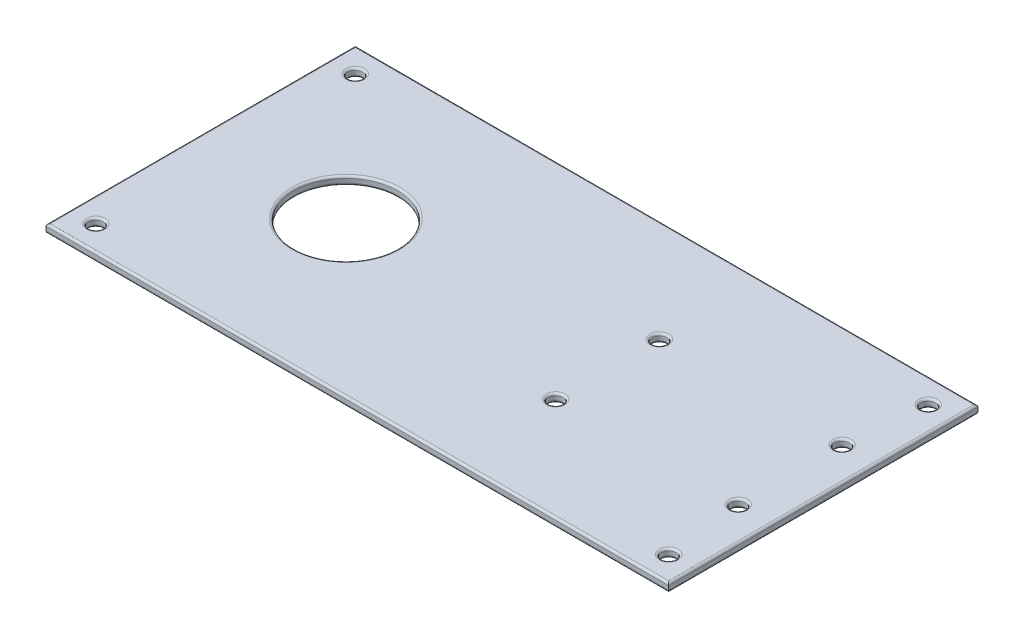
ISO-10303-21;
HEADER;
FILE_DESCRIPTION(('STEP AP214'),'2;1');
FILE_NAME('part.step','',(''),(''),'','','');
FILE_SCHEMA(('AUTOMOTIVE_DESIGN { 1 0 10303 214 1 1 1 1 }'));
ENDSEC;
DATA;
#1=APPLICATION_CONTEXT('core data for automotive mechanical design processes');
#2=APPLICATION_PROTOCOL_DEFINITION('international standard','automotive_design',2000,#1);
#3=PRODUCT_CONTEXT('',#1,'mechanical');
#4=PRODUCT('Part','Part','',(#3));
#5=PRODUCT_RELATED_PRODUCT_CATEGORY('part','',(#4));
#6=PRODUCT_DEFINITION_FORMATION('','',#4);
#7=PRODUCT_DEFINITION_CONTEXT('part definition',#1,'design');
#8=PRODUCT_DEFINITION('design','',#6,#7);
#9=PRODUCT_DEFINITION_SHAPE('','',#8);
#10=(LENGTH_UNIT() NAMED_UNIT(*) SI_UNIT(.MILLI.,.METRE.));
#11=(NAMED_UNIT(*) PLANE_ANGLE_UNIT() SI_UNIT($,.RADIAN.));
#12=(NAMED_UNIT(*) SI_UNIT($,.STERADIAN.) SOLID_ANGLE_UNIT());
#13=UNCERTAINTY_MEASURE_WITH_UNIT(LENGTH_MEASURE(1.E-05),#10,'distance_accuracy_value','');
#14=(GEOMETRIC_REPRESENTATION_CONTEXT(3) GLOBAL_UNCERTAINTY_ASSIGNED_CONTEXT((#13)) GLOBAL_UNIT_ASSIGNED_CONTEXT((#10,
#11,#12)) REPRESENTATION_CONTEXT('',''));
#15=CARTESIAN_POINT('',(0.,0.,0.));
#16=DIRECTION('',(0.,0.,1.));
#17=DIRECTION('',(1.,0.,0.));
#18=AXIS2_PLACEMENT_3D('',#15,#16,#17);
#19=CARTESIAN_POINT('',(0.,2.,0.));
#20=DIRECTION('',(0.,-1.,0.));
#21=DIRECTION('',(0.,0.,-1.));
#22=AXIS2_PLACEMENT_3D('',#19,#20,#21);
#23=PLANE('',#22);
#24=CARTESIAN_POINT('',(98.,2.,-24.75));
#25=DIRECTION('',(0.,-1.,0.));
#26=DIRECTION('',(0.,0.,-1.));
#27=AXIS2_PLACEMENT_3D('',#24,#25,#26);
#28=CIRCLE('',#27,2.25);
#29=CARTESIAN_POINT('',(98.,2.,-27.));
#30=VERTEX_POINT('',#29);
#31=EDGE_CURVE('E11',#30,#30,#28,.T.);
#32=ORIENTED_EDGE('',*,*,#31,.T.);
#33=EDGE_LOOP('',(#32));
#34=FACE_BOUND('',#33,.T.);
#35=CARTESIAN_POINT('',(142.,2.,-24.75));
#36=DIRECTION('',(0.,-1.,0.));
#37=DIRECTION('',(0.,0.,-1.));
#38=AXIS2_PLACEMENT_3D('',#35,#36,#37);
#39=CIRCLE('',#38,2.25000000000001);
#40=CARTESIAN_POINT('',(142.,2.,-27.));
#41=VERTEX_POINT('',#40);
#42=EDGE_CURVE('E48',#41,#41,#39,.T.);
#43=ORIENTED_EDGE('',*,*,#42,.T.);
#44=EDGE_LOOP('',(#43));
#45=FACE_BOUND('',#44,.T.);
#46=CARTESIAN_POINT('',(142.,2.,-49.75));
#47=DIRECTION('',(0.,-1.,0.));
#48=DIRECTION('',(0.,0.,-1.));
#49=AXIS2_PLACEMENT_3D('',#46,#47,#48);
#50=CIRCLE('',#49,2.25000000000001);
#51=CARTESIAN_POINT('',(142.,2.,-52.));
#52=VERTEX_POINT('',#51);
#53=EDGE_CURVE('E250',#52,#52,#50,.T.);
#54=ORIENTED_EDGE('',*,*,#53,.T.);
#55=EDGE_LOOP('',(#54));
#56=FACE_BOUND('',#55,.T.);
#57=CARTESIAN_POINT('',(98.,2.,-49.75));
#58=DIRECTION('',(0.,-1.,0.));
#59=DIRECTION('',(0.,0.,-1.));
#60=AXIS2_PLACEMENT_3D('',#57,#58,#59);
#61=CIRCLE('',#60,2.25);
#62=CARTESIAN_POINT('',(98.,2.,-52.));
#63=VERTEX_POINT('',#62);
#64=EDGE_CURVE('E245',#63,#63,#61,.T.);
#65=ORIENTED_EDGE('',*,*,#64,.T.);
#66=EDGE_LOOP('',(#65));
#67=FACE_BOUND('',#66,.T.);
#68=CARTESIAN_POINT('',(6.,2.,-6.00000000000001));
#69=DIRECTION('',(0.,-1.,0.));
#70=DIRECTION('',(0.,0.,-1.));
#71=AXIS2_PLACEMENT_3D('',#68,#69,#70);
#72=CIRCLE('',#71,2.25);
#73=CARTESIAN_POINT('',(6.,2.,-8.25000000000001));
#74=VERTEX_POINT('',#73);
#75=EDGE_CURVE('E243',#74,#74,#72,.T.);
#76=ORIENTED_EDGE('',*,*,#75,.T.);
#77=EDGE_LOOP('',(#76));
#78=FACE_BOUND('',#77,.T.);
#79=CARTESIAN_POINT('',(6.,2.,-68.5));
#80=DIRECTION('',(0.,-1.,0.));
#81=DIRECTION('',(0.,0.,-1.));
#82=AXIS2_PLACEMENT_3D('',#79,#80,#81);
#83=CIRCLE('',#82,2.25);
#84=CARTESIAN_POINT('',(6.,2.,-70.75));
#85=VERTEX_POINT('',#84);
#86=EDGE_CURVE('E236',#85,#85,#83,.T.);
#87=ORIENTED_EDGE('',*,*,#86,.T.);
#88=EDGE_LOOP('',(#87));
#89=FACE_BOUND('',#88,.T.);
#90=CARTESIAN_POINT('',(35.,2.,-37.25));
#91=DIRECTION('',(0.,-1.,0.));
#92=DIRECTION('',(0.,0.,-1.));
#93=AXIS2_PLACEMENT_3D('',#90,#91,#92);
#94=CIRCLE('',#93,13.);
#95=CARTESIAN_POINT('',(35.,2.,-50.25));
#96=VERTEX_POINT('',#95);
#97=EDGE_CURVE('E231',#96,#96,#94,.T.);
#98=ORIENTED_EDGE('',*,*,#97,.T.);
#99=EDGE_LOOP('',(#98));
#100=FACE_BOUND('',#99,.T.);
#101=CARTESIAN_POINT('',(144.,2.,-68.5));
#102=DIRECTION('',(0.,-1.,0.));
#103=DIRECTION('',(0.,0.,-1.));
#104=AXIS2_PLACEMENT_3D('',#101,#102,#103);
#105=CIRCLE('',#104,2.25000000000001);
#106=CARTESIAN_POINT('',(144.,2.,-70.75));
#107=VERTEX_POINT('',#106);
#108=EDGE_CURVE('E235',#107,#107,#105,.T.);
#109=ORIENTED_EDGE('',*,*,#108,.T.);
#110=EDGE_LOOP('',(#109));
#111=FACE_BOUND('',#110,.T.);
#112=CARTESIAN_POINT('',(144.,2.,-6.));
#113=DIRECTION('',(0.,-1.,0.));
#114=DIRECTION('',(0.,0.,-1.));
#115=AXIS2_PLACEMENT_3D('',#112,#113,#114);
#116=CIRCLE('',#115,2.25000000000001);
#117=CARTESIAN_POINT('',(144.,2.,-8.25000000000001));
#118=VERTEX_POINT('',#117);
#119=EDGE_CURVE('E230',#118,#118,#116,.T.);
#120=ORIENTED_EDGE('',*,*,#119,.T.);
#121=EDGE_LOOP('',(#120));
#122=FACE_BOUND('',#121,.T.);
#123=DIRECTION('',(0.,0.,-1.));
#124=VECTOR('',#123,1.);
#125=CARTESIAN_POINT('',(149.5,2.,0.));
#126=LINE('',#125,#124);
#127=CARTESIAN_POINT('',(149.5,2.,-0.5));
#128=VERTEX_POINT('',#127);
#129=CARTESIAN_POINT('',(149.5,2.,-74.));
#130=VERTEX_POINT('',#129);
#131=EDGE_CURVE('E57',#128,#130,#126,.T.);
#132=ORIENTED_EDGE('',*,*,#131,.T.);
#133=DIRECTION('',(-1.,0.,0.));
#134=VECTOR('',#133,1.);
#135=CARTESIAN_POINT('',(0.,2.,-74.));
#136=LINE('',#135,#134);
#137=CARTESIAN_POINT('',(0.5,2.,-74.));
#138=VERTEX_POINT('',#137);
#139=EDGE_CURVE('E229',#130,#138,#136,.T.);
#140=ORIENTED_EDGE('',*,*,#139,.T.);
#141=DIRECTION('',(0.,0.,1.));
#142=VECTOR('',#141,1.);
#143=CARTESIAN_POINT('',(0.5,2.,0.));
#144=LINE('',#143,#142);
#145=CARTESIAN_POINT('',(0.5,2.,-0.5));
#146=VERTEX_POINT('',#145);
#147=EDGE_CURVE('E224',#138,#146,#144,.T.);
#148=ORIENTED_EDGE('',*,*,#147,.T.);
#149=DIRECTION('',(1.,0.,0.));
#150=VECTOR('',#149,1.);
#151=CARTESIAN_POINT('',(0.,2.,-0.5));
#152=LINE('',#151,#150);
#153=EDGE_CURVE('E63',#146,#128,#152,.T.);
#154=ORIENTED_EDGE('',*,*,#153,.T.);
#155=EDGE_LOOP('',(#132,#140,#148,#154));
#156=FACE_BOUND('',#155,.T.);
#157=ADVANCED_FACE('F39',(#34,#45,#56,#67,#78,#89,#100,#111,#122,#156),#23,.F.);
#158=CARTESIAN_POINT('',(0.,0.,0.));
#159=DIRECTION('',(0.,-1.,0.));
#160=DIRECTION('',(0.,0.,-1.));
#161=AXIS2_PLACEMENT_3D('',#158,#159,#160);
#162=PLANE('',#161);
#163=CARTESIAN_POINT('',(98.,0.,-24.75));
#164=DIRECTION('',(0.,-1.,0.));
#165=DIRECTION('',(0.,0.,-1.));
#166=AXIS2_PLACEMENT_3D('',#163,#164,#165);
#167=CIRCLE('',#166,2.25);
#168=CARTESIAN_POINT('',(98.,0.,-27.));
#169=VERTEX_POINT('',#168);
#170=EDGE_CURVE('E147',#169,#169,#167,.F.);
#171=ORIENTED_EDGE('',*,*,#170,.T.);
#172=EDGE_LOOP('',(#171));
#173=FACE_BOUND('',#172,.T.);
#174=CARTESIAN_POINT('',(142.,0.,-49.75));
#175=DIRECTION('',(0.,-1.,0.));
#176=DIRECTION('',(0.,0.,-1.));
#177=AXIS2_PLACEMENT_3D('',#174,#175,#176);
#178=CIRCLE('',#177,2.25000000000001);
#179=CARTESIAN_POINT('',(142.,0.,-52.));
#180=VERTEX_POINT('',#179);
#181=EDGE_CURVE('E150',#180,#180,#178,.F.);
#182=ORIENTED_EDGE('',*,*,#181,.T.);
#183=EDGE_LOOP('',(#182));
#184=FACE_BOUND('',#183,.T.);
#185=CARTESIAN_POINT('',(6.,0.,-6.00000000000001));
#186=DIRECTION('',(0.,-1.,0.));
#187=DIRECTION('',(0.,0.,-1.));
#188=AXIS2_PLACEMENT_3D('',#185,#186,#187);
#189=CIRCLE('',#188,2.25);
#190=CARTESIAN_POINT('',(6.,0.,-8.25000000000001));
#191=VERTEX_POINT('',#190);
#192=EDGE_CURVE('E145',#191,#191,#189,.F.);
#193=ORIENTED_EDGE('',*,*,#192,.T.);
#194=EDGE_LOOP('',(#193));
#195=FACE_BOUND('',#194,.T.);
#196=CARTESIAN_POINT('',(35.,0.,-37.25));
#197=DIRECTION('',(0.,-1.,0.));
#198=DIRECTION('',(0.,0.,-1.));
#199=AXIS2_PLACEMENT_3D('',#196,#197,#198);
#200=CIRCLE('',#199,13.);
#201=CARTESIAN_POINT('',(35.,0.,-50.25));
#202=VERTEX_POINT('',#201);
#203=EDGE_CURVE('E140',#202,#202,#200,.F.);
#204=ORIENTED_EDGE('',*,*,#203,.T.);
#205=EDGE_LOOP('',(#204));
#206=FACE_BOUND('',#205,.T.);
#207=CARTESIAN_POINT('',(144.,0.,-6.));
#208=DIRECTION('',(0.,-1.,0.));
#209=DIRECTION('',(0.,0.,-1.));
#210=AXIS2_PLACEMENT_3D('',#207,#208,#209);
#211=CIRCLE('',#210,2.25000000000001);
#212=CARTESIAN_POINT('',(144.,0.,-8.25000000000001));
#213=VERTEX_POINT('',#212);
#214=EDGE_CURVE('E135',#213,#213,#211,.F.);
#215=ORIENTED_EDGE('',*,*,#214,.T.);
#216=EDGE_LOOP('',(#215));
#217=FACE_BOUND('',#216,.T.);
#218=DIRECTION('',(0.,0.,-1.));
#219=VECTOR('',#218,1.);
#220=CARTESIAN_POINT('',(149.5,0.,0.));
#221=LINE('',#220,#219);
#222=CARTESIAN_POINT('',(149.5,0.,-74.));
#223=VERTEX_POINT('',#222);
#224=CARTESIAN_POINT('',(149.5,0.,-0.5));
#225=VERTEX_POINT('',#224);
#226=EDGE_CURVE('E132',#223,#225,#221,.F.);
#227=ORIENTED_EDGE('',*,*,#226,.T.);
#228=DIRECTION('',(1.,0.,0.));
#229=VECTOR('',#228,1.);
#230=CARTESIAN_POINT('',(0.,0.,-0.5));
#231=LINE('',#230,#229);
#232=CARTESIAN_POINT('',(0.5,0.,-0.5));
#233=VERTEX_POINT('',#232);
#234=EDGE_CURVE('E112',#225,#233,#231,.F.);
#235=ORIENTED_EDGE('',*,*,#234,.T.);
#236=DIRECTION('',(0.,0.,1.));
#237=VECTOR('',#236,1.);
#238=CARTESIAN_POINT('',(0.5,0.,-74.5));
#239=LINE('',#238,#237);
#240=CARTESIAN_POINT('',(0.5,0.,-74.));
#241=VERTEX_POINT('',#240);
#242=EDGE_CURVE('E122',#233,#241,#239,.F.);
#243=ORIENTED_EDGE('',*,*,#242,.T.);
#244=DIRECTION('',(-1.,0.,0.));
#245=VECTOR('',#244,1.);
#246=CARTESIAN_POINT('',(150.,0.,-74.));
#247=LINE('',#246,#245);
#248=EDGE_CURVE('E130',#241,#223,#247,.F.);
#249=ORIENTED_EDGE('',*,*,#248,.T.);
#250=EDGE_LOOP('',(#227,#235,#243,#249));
#251=FACE_BOUND('',#250,.T.);
#252=CARTESIAN_POINT('',(144.,0.,-68.5));
#253=DIRECTION('',(0.,-1.,0.));
#254=DIRECTION('',(0.,0.,-1.));
#255=AXIS2_PLACEMENT_3D('',#252,#253,#254);
#256=CIRCLE('',#255,2.25000000000001);
#257=CARTESIAN_POINT('',(144.,0.,-70.75));
#258=VERTEX_POINT('',#257);
#259=EDGE_CURVE('E126',#258,#258,#256,.F.);
#260=ORIENTED_EDGE('',*,*,#259,.T.);
#261=EDGE_LOOP('',(#260));
#262=FACE_BOUND('',#261,.T.);
#263=CARTESIAN_POINT('',(6.,0.,-68.5));
#264=DIRECTION('',(0.,-1.,0.));
#265=DIRECTION('',(0.,0.,-1.));
#266=AXIS2_PLACEMENT_3D('',#263,#264,#265);
#267=CIRCLE('',#266,2.25);
#268=CARTESIAN_POINT('',(6.,0.,-70.75));
#269=VERTEX_POINT('',#268);
#270=EDGE_CURVE('E293',#269,#269,#267,.F.);
#271=ORIENTED_EDGE('',*,*,#270,.T.);
#272=EDGE_LOOP('',(#271));
#273=FACE_BOUND('',#272,.T.);
#274=CARTESIAN_POINT('',(98.,0.,-49.75));
#275=DIRECTION('',(0.,-1.,0.));
#276=DIRECTION('',(0.,0.,-1.));
#277=AXIS2_PLACEMENT_3D('',#274,#275,#276);
#278=CIRCLE('',#277,2.25);
#279=CARTESIAN_POINT('',(98.,0.,-52.));
#280=VERTEX_POINT('',#279);
#281=EDGE_CURVE('E290',#280,#280,#278,.F.);
#282=ORIENTED_EDGE('',*,*,#281,.T.);
#283=EDGE_LOOP('',(#282));
#284=FACE_BOUND('',#283,.T.);
#285=CARTESIAN_POINT('',(142.,0.,-24.75));
#286=DIRECTION('',(0.,-1.,0.));
#287=DIRECTION('',(0.,0.,-1.));
#288=AXIS2_PLACEMENT_3D('',#285,#286,#287);
#289=CIRCLE('',#288,2.25000000000001);
#290=CARTESIAN_POINT('',(142.,0.,-27.));
#291=VERTEX_POINT('',#290);
#292=EDGE_CURVE('E285',#291,#291,#289,.F.);
#293=ORIENTED_EDGE('',*,*,#292,.T.);
#294=EDGE_LOOP('',(#293));
#295=FACE_BOUND('',#294,.T.);
#296=ADVANCED_FACE('F128',(#173,#184,#195,#206,#217,#251,#262,#273,#284,#295),#162,.T.);
#297=CARTESIAN_POINT('',(0.,2.,0.));
#298=DIRECTION('',(1.,0.,0.));
#299=DIRECTION('',(0.,0.,-1.));
#300=AXIS2_PLACEMENT_3D('',#297,#298,#299);
#301=PLANE('',#300);
#302=DIRECTION('',(0.,-1.,0.));
#303=VECTOR('',#302,1.);
#304=CARTESIAN_POINT('',(0.,2.,-74.5));
#305=LINE('',#304,#303);
#306=CARTESIAN_POINT('',(0.,1.5,-74.5));
#307=VERTEX_POINT('',#306);
#308=CARTESIAN_POINT('',(0.,0.5,-74.5));
#309=VERTEX_POINT('',#308);
#310=EDGE_CURVE('E258',#307,#309,#305,.T.);
#311=ORIENTED_EDGE('',*,*,#310,.T.);
#312=DIRECTION('',(0.,0.,1.));
#313=VECTOR('',#312,1.);
#314=CARTESIAN_POINT('',(0.,0.5,0.));
#315=LINE('',#314,#313);
#316=CARTESIAN_POINT('',(0.,0.5,0.));
#317=VERTEX_POINT('',#316);
#318=EDGE_CURVE('E197',#309,#317,#315,.T.);
#319=ORIENTED_EDGE('',*,*,#318,.T.);
#320=DIRECTION('',(0.,-1.,0.));
#321=VECTOR('',#320,1.);
#322=CARTESIAN_POINT('',(0.,2.,0.));
#323=LINE('',#322,#321);
#324=CARTESIAN_POINT('',(0.,1.5,0.));
#325=VERTEX_POINT('',#324);
#326=EDGE_CURVE('E280',#325,#317,#323,.T.);
#327=ORIENTED_EDGE('',*,*,#326,.F.);
#328=DIRECTION('',(0.,0.,1.));
#329=VECTOR('',#328,1.);
#330=CARTESIAN_POINT('',(0.,1.5,0.));
#331=LINE('',#330,#329);
#332=EDGE_CURVE('E191',#325,#307,#331,.F.);
#333=ORIENTED_EDGE('',*,*,#332,.T.);
#334=EDGE_LOOP('',(#311,#319,#327,#333));
#335=FACE_BOUND('',#334,.T.);
#336=ADVANCED_FACE('F284',(#335),#301,.F.);
#337=CARTESIAN_POINT('',(0.,2.,0.));
#338=DIRECTION('',(0.,0.,-1.));
#339=DIRECTION('',(-1.,0.,0.));
#340=AXIS2_PLACEMENT_3D('',#337,#338,#339);
#341=PLANE('',#340);
#342=ORIENTED_EDGE('',*,*,#326,.T.);
#343=DIRECTION('',(1.,0.,0.));
#344=VECTOR('',#343,1.);
#345=CARTESIAN_POINT('',(150.,0.5,0.));
#346=LINE('',#345,#344);
#347=CARTESIAN_POINT('',(150.,0.5,0.));
#348=VERTEX_POINT('',#347);
#349=EDGE_CURVE('E111',#317,#348,#346,.T.);
#350=ORIENTED_EDGE('',*,*,#349,.T.);
#351=DIRECTION('',(0.,-1.,0.));
#352=VECTOR('',#351,1.);
#353=CARTESIAN_POINT('',(150.,2.,0.));
#354=LINE('',#353,#352);
#355=CARTESIAN_POINT('',(150.,1.5,0.));
#356=VERTEX_POINT('',#355);
#357=EDGE_CURVE('E276',#356,#348,#354,.T.);
#358=ORIENTED_EDGE('',*,*,#357,.F.);
#359=DIRECTION('',(1.,0.,0.));
#360=VECTOR('',#359,1.);
#361=CARTESIAN_POINT('',(0.,1.5,0.));
#362=LINE('',#361,#360);
#363=EDGE_CURVE('E181',#356,#325,#362,.F.);
#364=ORIENTED_EDGE('',*,*,#363,.T.);
#365=EDGE_LOOP('',(#342,#350,#358,#364));
#366=FACE_BOUND('',#365,.T.);
#367=ADVANCED_FACE('F277',(#366),#341,.F.);
#368=CARTESIAN_POINT('',(150.,2.,0.));
#369=DIRECTION('',(-1.,0.,0.));
#370=DIRECTION('',(0.,0.,1.));
#371=AXIS2_PLACEMENT_3D('',#368,#369,#370);
#372=PLANE('',#371);
#373=ORIENTED_EDGE('',*,*,#357,.T.);
#374=DIRECTION('',(0.,0.,-1.));
#375=VECTOR('',#374,1.);
#376=CARTESIAN_POINT('',(150.,0.5,-74.5));
#377=LINE('',#376,#375);
#378=CARTESIAN_POINT('',(150.,0.5,-74.5));
#379=VERTEX_POINT('',#378);
#380=EDGE_CURVE('E187',#348,#379,#377,.T.);
#381=ORIENTED_EDGE('',*,*,#380,.T.);
#382=DIRECTION('',(0.,-1.,0.));
#383=VECTOR('',#382,1.);
#384=CARTESIAN_POINT('',(150.,2.,-74.5));
#385=LINE('',#384,#383);
#386=CARTESIAN_POINT('',(150.,1.5,-74.5));
#387=VERTEX_POINT('',#386);
#388=EDGE_CURVE('E289',#387,#379,#385,.T.);
#389=ORIENTED_EDGE('',*,*,#388,.F.);
#390=DIRECTION('',(0.,0.,-1.));
#391=VECTOR('',#390,1.);
#392=CARTESIAN_POINT('',(150.,1.5,0.));
#393=LINE('',#392,#391);
#394=EDGE_CURVE('E188',#387,#356,#393,.F.);
#395=ORIENTED_EDGE('',*,*,#394,.T.);
#396=EDGE_LOOP('',(#373,#381,#389,#395));
#397=FACE_BOUND('',#396,.T.);
#398=ADVANCED_FACE('F310',(#397),#372,.F.);
#399=CARTESIAN_POINT('',(0.,2.,-74.5));
#400=DIRECTION('',(0.,0.,1.));
#401=DIRECTION('',(1.,0.,0.));
#402=AXIS2_PLACEMENT_3D('',#399,#400,#401);
#403=PLANE('',#402);
#404=ORIENTED_EDGE('',*,*,#388,.T.);
#405=DIRECTION('',(-1.,0.,0.));
#406=VECTOR('',#405,1.);
#407=CARTESIAN_POINT('',(0.,0.5,-74.5));
#408=LINE('',#407,#406);
#409=EDGE_CURVE('E193',#379,#309,#408,.T.);
#410=ORIENTED_EDGE('',*,*,#409,.T.);
#411=ORIENTED_EDGE('',*,*,#310,.F.);
#412=DIRECTION('',(-1.,0.,0.));
#413=VECTOR('',#412,1.);
#414=CARTESIAN_POINT('',(0.,1.5,-74.5));
#415=LINE('',#414,#413);
#416=EDGE_CURVE('E186',#307,#387,#415,.F.);
#417=ORIENTED_EDGE('',*,*,#416,.T.);
#418=EDGE_LOOP('',(#404,#410,#411,#417));
#419=FACE_BOUND('',#418,.T.);
#420=ADVANCED_FACE('F311',(#419),#403,.F.);
#421=CARTESIAN_POINT('',(144.,2.,-6.));
#422=DIRECTION('',(0.,-1.,0.));
#423=DIRECTION('',(0.,0.,-1.));
#424=AXIS2_PLACEMENT_3D('',#421,#422,#423);
#425=CYLINDRICAL_SURFACE('',#424,1.75000000000001);
#426=CARTESIAN_POINT('',(144.,0.5,-6.));
#427=DIRECTION('',(0.,-1.,0.));
#428=DIRECTION('',(0.,0.,-1.));
#429=AXIS2_PLACEMENT_3D('',#426,#427,#428);
#430=CIRCLE('',#429,1.75000000000001);
#431=CARTESIAN_POINT('',(144.,0.5,-7.75000000000001));
#432=VERTEX_POINT('',#431);
#433=EDGE_CURVE('E176',#432,#432,#430,.T.);
#434=ORIENTED_EDGE('',*,*,#433,.T.);
#435=EDGE_LOOP('',(#434));
#436=FACE_BOUND('',#435,.T.);
#437=CARTESIAN_POINT('',(144.,1.5,-6.));
#438=DIRECTION('',(0.,-1.,0.));
#439=DIRECTION('',(0.,0.,-1.));
#440=AXIS2_PLACEMENT_3D('',#437,#438,#439);
#441=CIRCLE('',#440,1.75000000000001);
#442=CARTESIAN_POINT('',(144.,1.5,-7.75000000000001));
#443=VERTEX_POINT('',#442);
#444=EDGE_CURVE('E180',#443,#443,#441,.F.);
#445=ORIENTED_EDGE('',*,*,#444,.T.);
#446=EDGE_LOOP('',(#445));
#447=FACE_BOUND('',#446,.T.);
#448=ADVANCED_FACE('F328',(#436,#447),#425,.F.);
#449=CARTESIAN_POINT('',(144.,2.,-68.5));
#450=DIRECTION('',(0.,-1.,0.));
#451=DIRECTION('',(0.,0.,-1.));
#452=AXIS2_PLACEMENT_3D('',#449,#450,#451);
#453=CYLINDRICAL_SURFACE('',#452,1.75000000000001);
#454=CARTESIAN_POINT('',(144.,0.5,-68.5));
#455=DIRECTION('',(0.,-1.,0.));
#456=DIRECTION('',(0.,0.,-1.));
#457=AXIS2_PLACEMENT_3D('',#454,#455,#456);
#458=CIRCLE('',#457,1.75000000000001);
#459=CARTESIAN_POINT('',(144.,0.5,-70.25));
#460=VERTEX_POINT('',#459);
#461=EDGE_CURVE('E205',#460,#460,#458,.T.);
#462=ORIENTED_EDGE('',*,*,#461,.T.);
#463=EDGE_LOOP('',(#462));
#464=FACE_BOUND('',#463,.T.);
#465=CARTESIAN_POINT('',(144.,1.5,-68.5));
#466=DIRECTION('',(0.,-1.,0.));
#467=DIRECTION('',(0.,0.,-1.));
#468=AXIS2_PLACEMENT_3D('',#465,#466,#467);
#469=CIRCLE('',#468,1.75000000000001);
#470=CARTESIAN_POINT('',(144.,1.5,-70.25));
#471=VERTEX_POINT('',#470);
#472=EDGE_CURVE('E200',#471,#471,#469,.F.);
#473=ORIENTED_EDGE('',*,*,#472,.T.);
#474=EDGE_LOOP('',(#473));
#475=FACE_BOUND('',#474,.T.);
#476=ADVANCED_FACE('F601',(#464,#475),#453,.F.);
#477=CARTESIAN_POINT('',(35.,2.,-37.25));
#478=DIRECTION('',(0.,-1.,0.));
#479=DIRECTION('',(0.,0.,-1.));
#480=AXIS2_PLACEMENT_3D('',#477,#478,#479);
#481=CYLINDRICAL_SURFACE('',#480,12.5);
#482=CARTESIAN_POINT('',(35.,0.5,-37.25));
#483=DIRECTION('',(0.,-1.,0.));
#484=DIRECTION('',(0.,0.,-1.));
#485=AXIS2_PLACEMENT_3D('',#482,#483,#484);
#486=CIRCLE('',#485,12.5);
#487=CARTESIAN_POINT('',(35.,0.5,-49.75));
#488=VERTEX_POINT('',#487);
#489=EDGE_CURVE('E175',#488,#488,#486,.T.);
#490=ORIENTED_EDGE('',*,*,#489,.T.);
#491=EDGE_LOOP('',(#490));
#492=FACE_BOUND('',#491,.T.);
#493=CARTESIAN_POINT('',(35.,1.5,-37.25));
#494=DIRECTION('',(0.,-1.,0.));
#495=DIRECTION('',(0.,0.,-1.));
#496=AXIS2_PLACEMENT_3D('',#493,#494,#495);
#497=CIRCLE('',#496,12.5);
#498=CARTESIAN_POINT('',(35.,1.5,-49.75));
#499=VERTEX_POINT('',#498);
#500=EDGE_CURVE('E173',#499,#499,#497,.F.);
#501=ORIENTED_EDGE('',*,*,#500,.T.);
#502=EDGE_LOOP('',(#501));
#503=FACE_BOUND('',#502,.T.);
#504=ADVANCED_FACE('F595',(#492,#503),#481,.F.);
#505=CARTESIAN_POINT('',(6.,2.,-68.5));
#506=DIRECTION('',(0.,-1.,0.));
#507=DIRECTION('',(0.,0.,-1.));
#508=AXIS2_PLACEMENT_3D('',#505,#506,#507);
#509=CYLINDRICAL_SURFACE('',#508,1.75);
#510=CARTESIAN_POINT('',(6.,0.5,-68.5));
#511=DIRECTION('',(0.,-1.,0.));
#512=DIRECTION('',(0.,0.,-1.));
#513=AXIS2_PLACEMENT_3D('',#510,#511,#512);
#514=CIRCLE('',#513,1.75);
#515=CARTESIAN_POINT('',(6.,0.5,-70.25));
#516=VERTEX_POINT('',#515);
#517=EDGE_CURVE('E208',#516,#516,#514,.T.);
#518=ORIENTED_EDGE('',*,*,#517,.T.);
#519=EDGE_LOOP('',(#518));
#520=FACE_BOUND('',#519,.T.);
#521=CARTESIAN_POINT('',(6.,1.5,-68.5));
#522=DIRECTION('',(0.,-1.,0.));
#523=DIRECTION('',(0.,0.,-1.));
#524=AXIS2_PLACEMENT_3D('',#521,#522,#523);
#525=CIRCLE('',#524,1.75);
#526=CARTESIAN_POINT('',(6.,1.5,-70.25));
#527=VERTEX_POINT('',#526);
#528=EDGE_CURVE('E202',#527,#527,#525,.F.);
#529=ORIENTED_EDGE('',*,*,#528,.T.);
#530=EDGE_LOOP('',(#529));
#531=FACE_BOUND('',#530,.T.);
#532=ADVANCED_FACE('F581',(#520,#531),#509,.F.);
#533=CARTESIAN_POINT('',(6.,2.,-6.00000000000001));
#534=DIRECTION('',(0.,-1.,0.));
#535=DIRECTION('',(0.,0.,-1.));
#536=AXIS2_PLACEMENT_3D('',#533,#534,#535);
#537=CYLINDRICAL_SURFACE('',#536,1.75);
#538=CARTESIAN_POINT('',(6.,0.5,-6.00000000000001));
#539=DIRECTION('',(0.,-1.,0.));
#540=DIRECTION('',(0.,0.,-1.));
#541=AXIS2_PLACEMENT_3D('',#538,#539,#540);
#542=CIRCLE('',#541,1.75);
#543=CARTESIAN_POINT('',(6.,0.5,-7.75000000000001));
#544=VERTEX_POINT('',#543);
#545=EDGE_CURVE('E169',#544,#544,#542,.T.);
#546=ORIENTED_EDGE('',*,*,#545,.T.);
#547=EDGE_LOOP('',(#546));
#548=FACE_BOUND('',#547,.T.);
#549=CARTESIAN_POINT('',(6.,1.5,-6.00000000000001));
#550=DIRECTION('',(0.,-1.,0.));
#551=DIRECTION('',(0.,0.,-1.));
#552=AXIS2_PLACEMENT_3D('',#549,#550,#551);
#553=CIRCLE('',#552,1.75);
#554=CARTESIAN_POINT('',(6.,1.5,-7.75000000000001));
#555=VERTEX_POINT('',#554);
#556=EDGE_CURVE('E164',#555,#555,#553,.F.);
#557=ORIENTED_EDGE('',*,*,#556,.T.);
#558=EDGE_LOOP('',(#557));
#559=FACE_BOUND('',#558,.T.);
#560=ADVANCED_FACE('F575',(#548,#559),#537,.F.);
#561=CARTESIAN_POINT('',(98.,2.,-49.75));
#562=DIRECTION('',(0.,-1.,0.));
#563=DIRECTION('',(0.,0.,-1.));
#564=AXIS2_PLACEMENT_3D('',#561,#562,#563);
#565=CYLINDRICAL_SURFACE('',#564,1.75);
#566=CARTESIAN_POINT('',(98.,0.5,-49.75));
#567=DIRECTION('',(0.,-1.,0.));
#568=DIRECTION('',(0.,0.,-1.));
#569=AXIS2_PLACEMENT_3D('',#566,#567,#568);
#570=CIRCLE('',#569,1.75);
#571=CARTESIAN_POINT('',(98.,0.5,-51.5));
#572=VERTEX_POINT('',#571);
#573=EDGE_CURVE('E212',#572,#572,#570,.T.);
#574=ORIENTED_EDGE('',*,*,#573,.T.);
#575=EDGE_LOOP('',(#574));
#576=FACE_BOUND('',#575,.T.);
#577=CARTESIAN_POINT('',(98.,1.5,-49.75));
#578=DIRECTION('',(0.,-1.,0.));
#579=DIRECTION('',(0.,0.,-1.));
#580=AXIS2_PLACEMENT_3D('',#577,#578,#579);
#581=CIRCLE('',#580,1.75);
#582=CARTESIAN_POINT('',(98.,1.5,-51.5));
#583=VERTEX_POINT('',#582);
#584=EDGE_CURVE('E211',#583,#583,#581,.F.);
#585=ORIENTED_EDGE('',*,*,#584,.T.);
#586=EDGE_LOOP('',(#585));
#587=FACE_BOUND('',#586,.T.);
#588=ADVANCED_FACE('F561',(#576,#587),#565,.F.);
#589=CARTESIAN_POINT('',(142.,2.,-49.75));
#590=DIRECTION('',(0.,-1.,0.));
#591=DIRECTION('',(0.,0.,-1.));
#592=AXIS2_PLACEMENT_3D('',#589,#590,#591);
#593=CYLINDRICAL_SURFACE('',#592,1.75000000000001);
#594=CARTESIAN_POINT('',(142.,0.5,-49.75));
#595=DIRECTION('',(0.,-1.,0.));
#596=DIRECTION('',(0.,0.,-1.));
#597=AXIS2_PLACEMENT_3D('',#594,#595,#596);
#598=CIRCLE('',#597,1.75000000000001);
#599=CARTESIAN_POINT('',(142.,0.5,-51.5));
#600=VERTEX_POINT('',#599);
#601=EDGE_CURVE('E165',#600,#600,#598,.T.);
#602=ORIENTED_EDGE('',*,*,#601,.T.);
#603=EDGE_LOOP('',(#602));
#604=FACE_BOUND('',#603,.T.);
#605=CARTESIAN_POINT('',(142.,1.5,-49.75));
#606=DIRECTION('',(0.,-1.,0.));
#607=DIRECTION('',(0.,0.,-1.));
#608=AXIS2_PLACEMENT_3D('',#605,#606,#607);
#609=CIRCLE('',#608,1.75000000000001);
#610=CARTESIAN_POINT('',(142.,1.5,-51.5));
#611=VERTEX_POINT('',#610);
#612=EDGE_CURVE('E157',#611,#611,#609,.F.);
#613=ORIENTED_EDGE('',*,*,#612,.T.);
#614=EDGE_LOOP('',(#613));
#615=FACE_BOUND('',#614,.T.);
#616=ADVANCED_FACE('F558',(#604,#615),#593,.F.);
#617=CARTESIAN_POINT('',(142.,2.,-24.75));
#618=DIRECTION('',(0.,-1.,0.));
#619=DIRECTION('',(0.,0.,-1.));
#620=AXIS2_PLACEMENT_3D('',#617,#618,#619);
#621=CYLINDRICAL_SURFACE('',#620,1.75000000000001);
#622=CARTESIAN_POINT('',(142.,0.5,-24.75));
#623=DIRECTION('',(0.,-1.,0.));
#624=DIRECTION('',(0.,0.,-1.));
#625=AXIS2_PLACEMENT_3D('',#622,#623,#624);
#626=CIRCLE('',#625,1.75000000000001);
#627=CARTESIAN_POINT('',(142.,0.5,-26.5));
#628=VERTEX_POINT('',#627);
#629=EDGE_CURVE('E219',#628,#628,#626,.T.);
#630=ORIENTED_EDGE('',*,*,#629,.T.);
#631=EDGE_LOOP('',(#630));
#632=FACE_BOUND('',#631,.T.);
#633=CARTESIAN_POINT('',(142.,1.5,-24.75));
#634=DIRECTION('',(0.,-1.,0.));
#635=DIRECTION('',(0.,0.,-1.));
#636=AXIS2_PLACEMENT_3D('',#633,#634,#635);
#637=CIRCLE('',#636,1.75000000000001);
#638=CARTESIAN_POINT('',(142.,1.5,-26.5));
#639=VERTEX_POINT('',#638);
#640=EDGE_CURVE('E220',#639,#639,#637,.F.);
#641=ORIENTED_EDGE('',*,*,#640,.T.);
#642=EDGE_LOOP('',(#641));
#643=FACE_BOUND('',#642,.T.);
#644=ADVANCED_FACE('F550',(#632,#643),#621,.F.);
#645=CARTESIAN_POINT('',(98.,2.,-24.75));
#646=DIRECTION('',(0.,-1.,0.));
#647=DIRECTION('',(0.,0.,-1.));
#648=AXIS2_PLACEMENT_3D('',#645,#646,#647);
#649=CYLINDRICAL_SURFACE('',#648,1.75);
#650=CARTESIAN_POINT('',(98.,0.5,-24.75));
#651=DIRECTION('',(0.,-1.,0.));
#652=DIRECTION('',(0.,0.,-1.));
#653=AXIS2_PLACEMENT_3D('',#650,#651,#652);
#654=CIRCLE('',#653,1.75);
#655=CARTESIAN_POINT('',(98.,0.5,-26.5));
#656=VERTEX_POINT('',#655);
#657=EDGE_CURVE('E156',#656,#656,#654,.T.);
#658=ORIENTED_EDGE('',*,*,#657,.T.);
#659=EDGE_LOOP('',(#658));
#660=FACE_BOUND('',#659,.T.);
#661=CARTESIAN_POINT('',(98.,1.5,-24.75));
#662=DIRECTION('',(0.,-1.,0.));
#663=DIRECTION('',(0.,0.,-1.));
#664=AXIS2_PLACEMENT_3D('',#661,#662,#663);
#665=CIRCLE('',#664,1.75);
#666=CARTESIAN_POINT('',(98.,1.5,-26.5));
#667=VERTEX_POINT('',#666);
#668=EDGE_CURVE('E153',#667,#667,#665,.F.);
#669=ORIENTED_EDGE('',*,*,#668,.T.);
#670=EDGE_LOOP('',(#669));
#671=FACE_BOUND('',#670,.T.);
#672=ADVANCED_FACE('F344',(#660,#671),#649,.F.);
#673=CARTESIAN_POINT('',(98.,0.5,-24.75));
#674=DIRECTION('',(0.,-1.,0.));
#675=DIRECTION('',(0.,0.,-1.));
#676=AXIS2_PLACEMENT_3D('',#673,#674,#675);
#677=TOROIDAL_SURFACE('',#676,2.25,0.5);
#678=ORIENTED_EDGE('',*,*,#657,.F.);
#679=EDGE_LOOP('',(#678));
#680=FACE_BOUND('',#679,.T.);
#681=ORIENTED_EDGE('',*,*,#170,.F.);
#682=EDGE_LOOP('',(#681));
#683=FACE_BOUND('',#682,.T.);
#684=ADVANCED_FACE('F336',(#680,#683),#677,.T.);
#685=CARTESIAN_POINT('',(142.,0.5,-49.75));
#686=DIRECTION('',(0.,-1.,0.));
#687=DIRECTION('',(0.,0.,-1.));
#688=AXIS2_PLACEMENT_3D('',#685,#686,#687);
#689=TOROIDAL_SURFACE('',#688,2.25000000000001,0.5);
#690=ORIENTED_EDGE('',*,*,#601,.F.);
#691=EDGE_LOOP('',(#690));
#692=FACE_BOUND('',#691,.T.);
#693=ORIENTED_EDGE('',*,*,#181,.F.);
#694=EDGE_LOOP('',(#693));
#695=FACE_BOUND('',#694,.T.);
#696=ADVANCED_FACE('F343',(#692,#695),#689,.T.);
#697=CARTESIAN_POINT('',(6.,0.5,-6.00000000000001));
#698=DIRECTION('',(0.,-1.,0.));
#699=DIRECTION('',(0.,0.,-1.));
#700=AXIS2_PLACEMENT_3D('',#697,#698,#699);
#701=TOROIDAL_SURFACE('',#700,2.25,0.5);
#702=ORIENTED_EDGE('',*,*,#545,.F.);
#703=EDGE_LOOP('',(#702));
#704=FACE_BOUND('',#703,.T.);
#705=ORIENTED_EDGE('',*,*,#192,.F.);
#706=EDGE_LOOP('',(#705));
#707=FACE_BOUND('',#706,.T.);
#708=ADVANCED_FACE('F346',(#704,#707),#701,.T.);
#709=CARTESIAN_POINT('',(35.,0.5,-37.25));
#710=DIRECTION('',(0.,-1.,0.));
#711=DIRECTION('',(0.,0.,-1.));
#712=AXIS2_PLACEMENT_3D('',#709,#710,#711);
#713=TOROIDAL_SURFACE('',#712,13.,0.5);
#714=ORIENTED_EDGE('',*,*,#489,.F.);
#715=EDGE_LOOP('',(#714));
#716=FACE_BOUND('',#715,.T.);
#717=ORIENTED_EDGE('',*,*,#203,.F.);
#718=EDGE_LOOP('',(#717));
#719=FACE_BOUND('',#718,.T.);
#720=ADVANCED_FACE('F354',(#716,#719),#713,.T.);
#721=CARTESIAN_POINT('',(144.,0.5,-6.));
#722=DIRECTION('',(0.,-1.,0.));
#723=DIRECTION('',(0.,0.,-1.));
#724=AXIS2_PLACEMENT_3D('',#721,#722,#723);
#725=TOROIDAL_SURFACE('',#724,2.25000000000001,0.5);
#726=ORIENTED_EDGE('',*,*,#433,.F.);
#727=EDGE_LOOP('',(#726));
#728=FACE_BOUND('',#727,.T.);
#729=ORIENTED_EDGE('',*,*,#214,.F.);
#730=EDGE_LOOP('',(#729));
#731=FACE_BOUND('',#730,.T.);
#732=ADVANCED_FACE('F357',(#728,#731),#725,.T.);
#733=CARTESIAN_POINT('',(0.,0.5,-74.));
#734=DIRECTION('',(1.,0.,0.));
#735=DIRECTION('',(0.,0.,-1.));
#736=AXIS2_PLACEMENT_3D('',#733,#734,#735);
#737=CYLINDRICAL_SURFACE('',#736,0.5);
#738=CARTESIAN_POINT('',(149.5,0.5,-74.));
#739=DIRECTION('',(0.707106781186547,0.,0.707106781186547));
#740=DIRECTION('',(0.707106781186547,0.,-0.707106781186547));
#741=AXIS2_PLACEMENT_3D('',#738,#739,#740);
#742=ELLIPSE('',#741,0.707106781186547,0.5);
#743=EDGE_CURVE('E119',#223,#379,#742,.T.);
#744=ORIENTED_EDGE('',*,*,#743,.F.);
#745=ORIENTED_EDGE('',*,*,#248,.F.);
#746=CARTESIAN_POINT('',(0.5,0.5,-74.));
#747=DIRECTION('',(0.707106781186547,0.,-0.707106781186547));
#748=DIRECTION('',(-0.707106781186547,0.,-0.707106781186547));
#749=AXIS2_PLACEMENT_3D('',#746,#747,#748);
#750=ELLIPSE('',#749,0.707106781186547,0.5);
#751=EDGE_CURVE('E124',#309,#241,#750,.F.);
#752=ORIENTED_EDGE('',*,*,#751,.F.);
#753=ORIENTED_EDGE('',*,*,#409,.F.);
#754=EDGE_LOOP('',(#744,#745,#752,#753));
#755=FACE_BOUND('',#754,.T.);
#756=ADVANCED_FACE('F305',(#755),#737,.T.);
#757=CARTESIAN_POINT('',(0.5,0.5,0.));
#758=DIRECTION('',(0.,0.,-1.));
#759=DIRECTION('',(-1.,0.,0.));
#760=AXIS2_PLACEMENT_3D('',#757,#758,#759);
#761=CYLINDRICAL_SURFACE('',#760,0.5);
#762=ORIENTED_EDGE('',*,*,#751,.T.);
#763=ORIENTED_EDGE('',*,*,#242,.F.);
#764=CARTESIAN_POINT('',(0.5,0.5,-0.5));
#765=DIRECTION('',(-0.707106781186547,0.,-0.707106781186547));
#766=DIRECTION('',(0.707106781186547,0.,-0.707106781186547));
#767=AXIS2_PLACEMENT_3D('',#764,#765,#766);
#768=ELLIPSE('',#767,0.707106781186547,0.5);
#769=EDGE_CURVE('E110',#317,#233,#768,.F.);
#770=ORIENTED_EDGE('',*,*,#769,.F.);
#771=ORIENTED_EDGE('',*,*,#318,.F.);
#772=EDGE_LOOP('',(#762,#763,#770,#771));
#773=FACE_BOUND('',#772,.T.);
#774=ADVANCED_FACE('F125',(#773),#761,.T.);
#775=CARTESIAN_POINT('',(149.5,0.5,0.));
#776=DIRECTION('',(0.,0.,1.));
#777=DIRECTION('',(1.,0.,0.));
#778=AXIS2_PLACEMENT_3D('',#775,#776,#777);
#779=CYLINDRICAL_SURFACE('',#778,0.5);
#780=ORIENTED_EDGE('',*,*,#743,.T.);
#781=ORIENTED_EDGE('',*,*,#380,.F.);
#782=CARTESIAN_POINT('',(149.5,0.5,-0.5));
#783=DIRECTION('',(-0.707106781186547,0.,0.707106781186547));
#784=DIRECTION('',(0.707106781186547,0.,0.707106781186547));
#785=AXIS2_PLACEMENT_3D('',#782,#783,#784);
#786=ELLIPSE('',#785,0.707106781186547,0.5);
#787=EDGE_CURVE('E117',#225,#348,#786,.T.);
#788=ORIENTED_EDGE('',*,*,#787,.F.);
#789=ORIENTED_EDGE('',*,*,#226,.F.);
#790=EDGE_LOOP('',(#780,#781,#788,#789));
#791=FACE_BOUND('',#790,.T.);
#792=ADVANCED_FACE('F301',(#791),#779,.T.);
#793=CARTESIAN_POINT('',(0.,0.5,-0.5));
#794=DIRECTION('',(-1.,0.,0.));
#795=DIRECTION('',(0.,0.,1.));
#796=AXIS2_PLACEMENT_3D('',#793,#794,#795);
#797=CYLINDRICAL_SURFACE('',#796,0.5);
#798=ORIENTED_EDGE('',*,*,#769,.T.);
#799=ORIENTED_EDGE('',*,*,#234,.F.);
#800=ORIENTED_EDGE('',*,*,#787,.T.);
#801=ORIENTED_EDGE('',*,*,#349,.F.);
#802=EDGE_LOOP('',(#798,#799,#800,#801));
#803=FACE_BOUND('',#802,.T.);
#804=ADVANCED_FACE('F108',(#803),#797,.T.);
#805=CARTESIAN_POINT('',(144.,0.5,-68.5));
#806=DIRECTION('',(0.,-1.,0.));
#807=DIRECTION('',(0.,0.,-1.));
#808=AXIS2_PLACEMENT_3D('',#805,#806,#807);
#809=TOROIDAL_SURFACE('',#808,2.25000000000001,0.5);
#810=ORIENTED_EDGE('',*,*,#461,.F.);
#811=EDGE_LOOP('',(#810));
#812=FACE_BOUND('',#811,.T.);
#813=ORIENTED_EDGE('',*,*,#259,.F.);
#814=EDGE_LOOP('',(#813));
#815=FACE_BOUND('',#814,.T.);
#816=ADVANCED_FACE('F361',(#812,#815),#809,.T.);
#817=CARTESIAN_POINT('',(6.,0.5,-68.5));
#818=DIRECTION('',(0.,-1.,0.));
#819=DIRECTION('',(0.,0.,-1.));
#820=AXIS2_PLACEMENT_3D('',#817,#818,#819);
#821=TOROIDAL_SURFACE('',#820,2.25,0.5);
#822=ORIENTED_EDGE('',*,*,#517,.F.);
#823=EDGE_LOOP('',(#822));
#824=FACE_BOUND('',#823,.T.);
#825=ORIENTED_EDGE('',*,*,#270,.F.);
#826=EDGE_LOOP('',(#825));
#827=FACE_BOUND('',#826,.T.);
#828=ADVANCED_FACE('F375',(#824,#827),#821,.T.);
#829=CARTESIAN_POINT('',(98.,0.5,-49.75));
#830=DIRECTION('',(0.,-1.,0.));
#831=DIRECTION('',(0.,0.,-1.));
#832=AXIS2_PLACEMENT_3D('',#829,#830,#831);
#833=TOROIDAL_SURFACE('',#832,2.25,0.5);
#834=ORIENTED_EDGE('',*,*,#573,.F.);
#835=EDGE_LOOP('',(#834));
#836=FACE_BOUND('',#835,.T.);
#837=ORIENTED_EDGE('',*,*,#281,.F.);
#838=EDGE_LOOP('',(#837));
#839=FACE_BOUND('',#838,.T.);
#840=ADVANCED_FACE('F376',(#836,#839),#833,.T.);
#841=CARTESIAN_POINT('',(142.,0.5,-24.75));
#842=DIRECTION('',(0.,-1.,0.));
#843=DIRECTION('',(0.,0.,-1.));
#844=AXIS2_PLACEMENT_3D('',#841,#842,#843);
#845=TOROIDAL_SURFACE('',#844,2.25000000000001,0.5);
#846=ORIENTED_EDGE('',*,*,#629,.F.);
#847=EDGE_LOOP('',(#846));
#848=FACE_BOUND('',#847,.T.);
#849=ORIENTED_EDGE('',*,*,#292,.F.);
#850=EDGE_LOOP('',(#849));
#851=FACE_BOUND('',#850,.T.);
#852=ADVANCED_FACE('F379',(#848,#851),#845,.T.);
#853=CARTESIAN_POINT('',(98.,1.5,-24.75));
#854=DIRECTION('',(0.,-1.,0.));
#855=DIRECTION('',(0.,0.,-1.));
#856=AXIS2_PLACEMENT_3D('',#853,#854,#855);
#857=TOROIDAL_SURFACE('',#856,2.25,0.5);
#858=ORIENTED_EDGE('',*,*,#31,.F.);
#859=EDGE_LOOP('',(#858));
#860=FACE_BOUND('',#859,.T.);
#861=ORIENTED_EDGE('',*,*,#668,.F.);
#862=EDGE_LOOP('',(#861));
#863=FACE_BOUND('',#862,.T.);
#864=ADVANCED_FACE('F383',(#860,#863),#857,.T.);
#865=CARTESIAN_POINT('',(142.,1.5,-24.75));
#866=DIRECTION('',(0.,-1.,0.));
#867=DIRECTION('',(0.,0.,-1.));
#868=AXIS2_PLACEMENT_3D('',#865,#866,#867);
#869=TOROIDAL_SURFACE('',#868,2.25000000000001,0.5);
#870=ORIENTED_EDGE('',*,*,#42,.F.);
#871=EDGE_LOOP('',(#870));
#872=FACE_BOUND('',#871,.T.);
#873=ORIENTED_EDGE('',*,*,#640,.F.);
#874=EDGE_LOOP('',(#873));
#875=FACE_BOUND('',#874,.T.);
#876=ADVANCED_FACE('F389',(#872,#875),#869,.T.);
#877=CARTESIAN_POINT('',(142.,1.5,-49.75));
#878=DIRECTION('',(0.,-1.,0.));
#879=DIRECTION('',(0.,0.,-1.));
#880=AXIS2_PLACEMENT_3D('',#877,#878,#879);
#881=TOROIDAL_SURFACE('',#880,2.25000000000001,0.5);
#882=ORIENTED_EDGE('',*,*,#53,.F.);
#883=EDGE_LOOP('',(#882));
#884=FACE_BOUND('',#883,.T.);
#885=ORIENTED_EDGE('',*,*,#612,.F.);
#886=EDGE_LOOP('',(#885));
#887=FACE_BOUND('',#886,.T.);
#888=ADVANCED_FACE('F394',(#884,#887),#881,.T.);
#889=CARTESIAN_POINT('',(98.,1.5,-49.75));
#890=DIRECTION('',(0.,-1.,0.));
#891=DIRECTION('',(0.,0.,-1.));
#892=AXIS2_PLACEMENT_3D('',#889,#890,#891);
#893=TOROIDAL_SURFACE('',#892,2.25,0.5);
#894=ORIENTED_EDGE('',*,*,#64,.F.);
#895=EDGE_LOOP('',(#894));
#896=FACE_BOUND('',#895,.T.);
#897=ORIENTED_EDGE('',*,*,#584,.F.);
#898=EDGE_LOOP('',(#897));
#899=FACE_BOUND('',#898,.T.);
#900=ADVANCED_FACE('F397',(#896,#899),#893,.T.);
#901=CARTESIAN_POINT('',(6.,1.5,-6.00000000000001));
#902=DIRECTION('',(0.,-1.,0.));
#903=DIRECTION('',(0.,0.,-1.));
#904=AXIS2_PLACEMENT_3D('',#901,#902,#903);
#905=TOROIDAL_SURFACE('',#904,2.25,0.5);
#906=ORIENTED_EDGE('',*,*,#75,.F.);
#907=EDGE_LOOP('',(#906));
#908=FACE_BOUND('',#907,.T.);
#909=ORIENTED_EDGE('',*,*,#556,.F.);
#910=EDGE_LOOP('',(#909));
#911=FACE_BOUND('',#910,.T.);
#912=ADVANCED_FACE('F396',(#908,#911),#905,.T.);
#913=CARTESIAN_POINT('',(6.,1.5,-68.5));
#914=DIRECTION('',(0.,-1.,0.));
#915=DIRECTION('',(0.,0.,-1.));
#916=AXIS2_PLACEMENT_3D('',#913,#914,#915);
#917=TOROIDAL_SURFACE('',#916,2.25,0.5);
#918=ORIENTED_EDGE('',*,*,#86,.F.);
#919=EDGE_LOOP('',(#918));
#920=FACE_BOUND('',#919,.T.);
#921=ORIENTED_EDGE('',*,*,#528,.F.);
#922=EDGE_LOOP('',(#921));
#923=FACE_BOUND('',#922,.T.);
#924=ADVANCED_FACE('F404',(#920,#923),#917,.T.);
#925=CARTESIAN_POINT('',(35.,1.5,-37.25));
#926=DIRECTION('',(0.,-1.,0.));
#927=DIRECTION('',(0.,0.,-1.));
#928=AXIS2_PLACEMENT_3D('',#925,#926,#927);
#929=TOROIDAL_SURFACE('',#928,13.,0.5);
#930=ORIENTED_EDGE('',*,*,#97,.F.);
#931=EDGE_LOOP('',(#930));
#932=FACE_BOUND('',#931,.T.);
#933=ORIENTED_EDGE('',*,*,#500,.F.);
#934=EDGE_LOOP('',(#933));
#935=FACE_BOUND('',#934,.T.);
#936=ADVANCED_FACE('F407',(#932,#935),#929,.T.);
#937=CARTESIAN_POINT('',(144.,1.5,-68.5));
#938=DIRECTION('',(0.,-1.,0.));
#939=DIRECTION('',(0.,0.,-1.));
#940=AXIS2_PLACEMENT_3D('',#937,#938,#939);
#941=TOROIDAL_SURFACE('',#940,2.25000000000001,0.5);
#942=ORIENTED_EDGE('',*,*,#108,.F.);
#943=EDGE_LOOP('',(#942));
#944=FACE_BOUND('',#943,.T.);
#945=ORIENTED_EDGE('',*,*,#472,.F.);
#946=EDGE_LOOP('',(#945));
#947=FACE_BOUND('',#946,.T.);
#948=ADVANCED_FACE('F415',(#944,#947),#941,.T.);
#949=CARTESIAN_POINT('',(144.,1.5,-6.));
#950=DIRECTION('',(0.,-1.,0.));
#951=DIRECTION('',(0.,0.,-1.));
#952=AXIS2_PLACEMENT_3D('',#949,#950,#951);
#953=TOROIDAL_SURFACE('',#952,2.25000000000001,0.5);
#954=ORIENTED_EDGE('',*,*,#119,.F.);
#955=EDGE_LOOP('',(#954));
#956=FACE_BOUND('',#955,.T.);
#957=ORIENTED_EDGE('',*,*,#444,.F.);
#958=EDGE_LOOP('',(#957));
#959=FACE_BOUND('',#958,.T.);
#960=ADVANCED_FACE('F418',(#956,#959),#953,.T.);
#961=CARTESIAN_POINT('',(0.,1.5,-0.5));
#962=DIRECTION('',(1.,0.,0.));
#963=DIRECTION('',(0.,0.,-1.));
#964=AXIS2_PLACEMENT_3D('',#961,#962,#963);
#965=CYLINDRICAL_SURFACE('',#964,0.5);
#966=CARTESIAN_POINT('',(0.5,1.5,-0.5));
#967=DIRECTION('',(0.707106781186547,0.,0.707106781186547));
#968=DIRECTION('',(-0.707106781186547,0.,0.707106781186547));
#969=AXIS2_PLACEMENT_3D('',#966,#967,#968);
#970=ELLIPSE('',#969,0.707106781186547,0.5);
#971=EDGE_CURVE('E257',#325,#146,#970,.F.);
#972=ORIENTED_EDGE('',*,*,#971,.F.);
#973=ORIENTED_EDGE('',*,*,#363,.F.);
#974=CARTESIAN_POINT('',(149.5,1.5,-0.5));
#975=DIRECTION('',(0.707106781186547,0.,-0.707106781186547));
#976=DIRECTION('',(0.707106781186547,0.,0.707106781186547));
#977=AXIS2_PLACEMENT_3D('',#974,#975,#976);
#978=ELLIPSE('',#977,0.707106781186547,0.5);
#979=EDGE_CURVE('E43',#128,#356,#978,.T.);
#980=ORIENTED_EDGE('',*,*,#979,.F.);
#981=ORIENTED_EDGE('',*,*,#153,.F.);
#982=EDGE_LOOP('',(#972,#973,#980,#981));
#983=FACE_BOUND('',#982,.T.);
#984=ADVANCED_FACE('F41',(#983),#965,.T.);
#985=CARTESIAN_POINT('',(149.5,1.5,0.));
#986=DIRECTION('',(0.,0.,-1.));
#987=DIRECTION('',(-1.,0.,0.));
#988=AXIS2_PLACEMENT_3D('',#985,#986,#987);
#989=CYLINDRICAL_SURFACE('',#988,0.5);
#990=ORIENTED_EDGE('',*,*,#979,.T.);
#991=ORIENTED_EDGE('',*,*,#394,.F.);
#992=CARTESIAN_POINT('',(149.5,1.5,-74.));
#993=DIRECTION('',(-0.707106781186547,0.,-0.707106781186547));
#994=DIRECTION('',(0.707106781186547,0.,-0.707106781186547));
#995=AXIS2_PLACEMENT_3D('',#992,#993,#994);
#996=ELLIPSE('',#995,0.707106781186547,0.5);
#997=EDGE_CURVE('E259',#130,#387,#996,.T.);
#998=ORIENTED_EDGE('',*,*,#997,.F.);
#999=ORIENTED_EDGE('',*,*,#131,.F.);
#1000=EDGE_LOOP('',(#990,#991,#998,#999));
#1001=FACE_BOUND('',#1000,.T.);
#1002=ADVANCED_FACE('F267',(#1001),#989,.T.);
#1003=CARTESIAN_POINT('',(0.5,1.5,0.));
#1004=DIRECTION('',(0.,0.,1.));
#1005=DIRECTION('',(1.,0.,0.));
#1006=AXIS2_PLACEMENT_3D('',#1003,#1004,#1005);
#1007=CYLINDRICAL_SURFACE('',#1006,0.5);
#1008=ORIENTED_EDGE('',*,*,#971,.T.);
#1009=ORIENTED_EDGE('',*,*,#147,.F.);
#1010=CARTESIAN_POINT('',(0.5,1.5,-74.));
#1011=DIRECTION('',(-0.707106781186547,0.,0.707106781186547));
#1012=DIRECTION('',(0.707106781186547,0.,0.707106781186547));
#1013=AXIS2_PLACEMENT_3D('',#1010,#1011,#1012);
#1014=ELLIPSE('',#1013,0.707106781186547,0.5);
#1015=EDGE_CURVE('E260',#307,#138,#1014,.F.);
#1016=ORIENTED_EDGE('',*,*,#1015,.F.);
#1017=ORIENTED_EDGE('',*,*,#332,.F.);
#1018=EDGE_LOOP('',(#1008,#1009,#1016,#1017));
#1019=FACE_BOUND('',#1018,.T.);
#1020=ADVANCED_FACE('F318',(#1019),#1007,.T.);
#1021=CARTESIAN_POINT('',(0.,1.5,-74.));
#1022=DIRECTION('',(-1.,0.,0.));
#1023=DIRECTION('',(0.,0.,1.));
#1024=AXIS2_PLACEMENT_3D('',#1021,#1022,#1023);
#1025=CYLINDRICAL_SURFACE('',#1024,0.5);
#1026=ORIENTED_EDGE('',*,*,#997,.T.);
#1027=ORIENTED_EDGE('',*,*,#416,.F.);
#1028=ORIENTED_EDGE('',*,*,#1015,.T.);
#1029=ORIENTED_EDGE('',*,*,#139,.F.);
#1030=EDGE_LOOP('',(#1026,#1027,#1028,#1029));
#1031=FACE_BOUND('',#1030,.T.);
#1032=ADVANCED_FACE('F316',(#1031),#1025,.T.);
#1033=CLOSED_SHELL('',(#157,#296,#336,#367,#398,#420,#448,#476,#504,#532,#560,#588,#616,#644,
#672,#684,#696,#708,#720,#732,#756,#774,#792,#804,#816,#828,#840,#852,#864,#876,#888,#900,#912,
#924,#936,#948,#960,#984,#1002,#1020,#1032));
#1034=MANIFOLD_SOLID_BREP('B2',#1033);
#1035=ADVANCED_BREP_SHAPE_REPRESENTATION('',(#18,#1034),#14);
#1036=SHAPE_DEFINITION_REPRESENTATION(#9,#1035);
ENDSEC;
END-ISO-10303-21;
